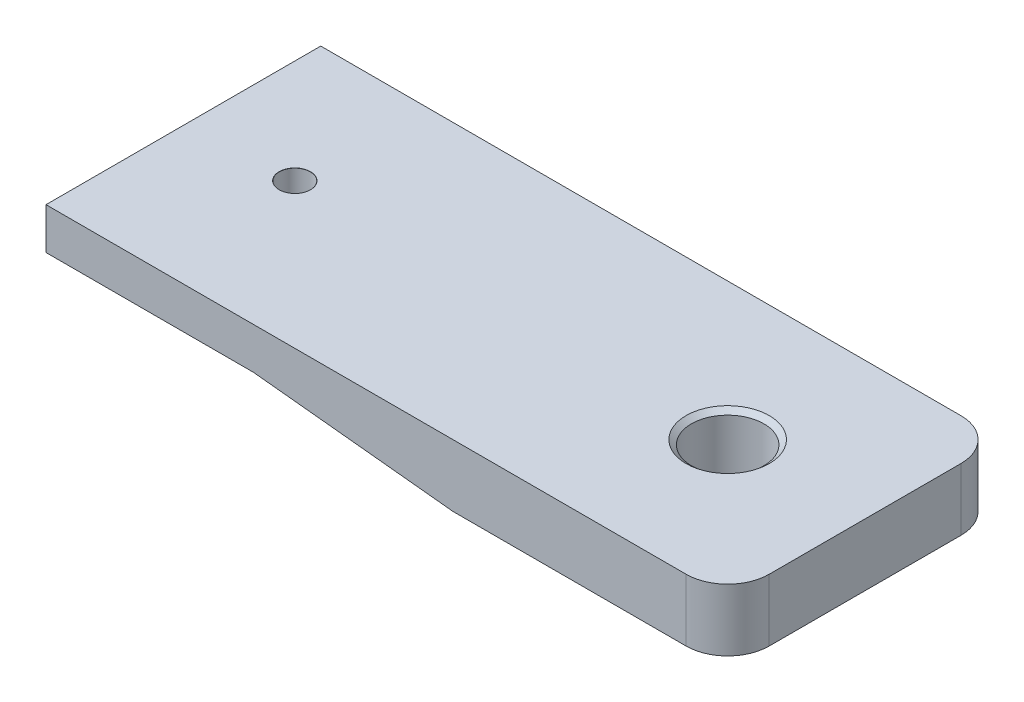
ISO-10303-21;
HEADER;
FILE_DESCRIPTION(('STEP AP214'),'2;1');
FILE_NAME('part.step','',(''),(''),'','','');
FILE_SCHEMA(('AUTOMOTIVE_DESIGN { 1 0 10303 214 1 1 1 1 }'));
ENDSEC;
DATA;
#1=APPLICATION_CONTEXT('core data for automotive mechanical design processes');
#2=APPLICATION_PROTOCOL_DEFINITION('international standard','automotive_design',2000,#1);
#3=PRODUCT_CONTEXT('',#1,'mechanical');
#4=PRODUCT('Part','Part','',(#3));
#5=PRODUCT_RELATED_PRODUCT_CATEGORY('part','',(#4));
#6=PRODUCT_DEFINITION_FORMATION('','',#4);
#7=PRODUCT_DEFINITION_CONTEXT('part definition',#1,'design');
#8=PRODUCT_DEFINITION('design','',#6,#7);
#9=PRODUCT_DEFINITION_SHAPE('','',#8);
#10=(LENGTH_UNIT() NAMED_UNIT(*) SI_UNIT(.MILLI.,.METRE.));
#11=(NAMED_UNIT(*) PLANE_ANGLE_UNIT() SI_UNIT($,.RADIAN.));
#12=(NAMED_UNIT(*) SI_UNIT($,.STERADIAN.) SOLID_ANGLE_UNIT());
#13=UNCERTAINTY_MEASURE_WITH_UNIT(LENGTH_MEASURE(1.E-05),#10,'distance_accuracy_value','');
#14=(GEOMETRIC_REPRESENTATION_CONTEXT(3) GLOBAL_UNCERTAINTY_ASSIGNED_CONTEXT((#13)) GLOBAL_UNIT_ASSIGNED_CONTEXT((#10,
#11,#12)) REPRESENTATION_CONTEXT('',''));
#15=CARTESIAN_POINT('',(0.,0.,0.));
#16=DIRECTION('',(0.,0.,1.));
#17=DIRECTION('',(1.,0.,0.));
#18=AXIS2_PLACEMENT_3D('',#15,#16,#17);
#19=CARTESIAN_POINT('',(-38.5,3.99999999999998,53.));
#20=DIRECTION('',(0.103339855073382,0.994646105081306,0.));
#21=DIRECTION('',(-0.994646105081306,0.103339855073382,0.));
#22=AXIS2_PLACEMENT_3D('',#19,#20,#21);
#23=PLANE('',#22);
#24=DIRECTION('',(0.994646105081306,-0.103339855073382,0.));
#25=VECTOR('',#24,1.);
#26=CARTESIAN_POINT('',(-38.5,3.99999999999998,0.));
#27=LINE('',#26,#25);
#28=CARTESIAN_POINT('',(-38.5,3.99999999999998,0.));
#29=VERTEX_POINT('',#28);
#30=CARTESIAN_POINT('',(0.,0.,0.));
#31=VERTEX_POINT('',#30);
#32=EDGE_CURVE('E122',#29,#31,#27,.T.);
#33=ORIENTED_EDGE('',*,*,#32,.T.);
#34=DIRECTION('',(0.,0.,-1.));
#35=VECTOR('',#34,1.);
#36=CARTESIAN_POINT('',(0.,0.,53.));
#37=LINE('',#36,#35);
#38=CARTESIAN_POINT('',(0.,0.,53.));
#39=VERTEX_POINT('',#38);
#40=EDGE_CURVE('E103',#39,#31,#37,.T.);
#41=ORIENTED_EDGE('',*,*,#40,.F.);
#42=DIRECTION('',(0.994646105081306,-0.103339855073382,0.));
#43=VECTOR('',#42,1.);
#44=CARTESIAN_POINT('',(-38.5,3.99999999999998,53.));
#45=LINE('',#44,#43);
#46=CARTESIAN_POINT('',(-38.5,3.99999999999998,53.));
#47=VERTEX_POINT('',#46);
#48=EDGE_CURVE('E110',#47,#39,#45,.T.);
#49=ORIENTED_EDGE('',*,*,#48,.F.);
#50=DIRECTION('',(0.,0.,-1.));
#51=VECTOR('',#50,1.);
#52=CARTESIAN_POINT('',(-38.5,3.99999999999998,53.));
#53=LINE('',#52,#51);
#54=EDGE_CURVE('E157',#47,#29,#53,.T.);
#55=ORIENTED_EDGE('',*,*,#54,.T.);
#56=EDGE_LOOP('',(#33,#41,#49,#55));
#57=FACE_BOUND('',#56,.T.);
#58=ADVANCED_FACE('F35',(#57),#23,.F.);
#59=CARTESIAN_POINT('',(0.,0.,53.));
#60=DIRECTION('',(0.,1.,0.));
#61=DIRECTION('',(0.,0.,1.));
#62=AXIS2_PLACEMENT_3D('',#59,#60,#61);
#63=PLANE('',#62);
#64=CARTESIAN_POINT('',(26.5,0.,26.5));
#65=DIRECTION('',(0.,1.,0.));
#66=DIRECTION('',(0.,0.,1.));
#67=AXIS2_PLACEMENT_3D('',#64,#65,#66);
#68=CIRCLE('',#67,7.);
#69=CARTESIAN_POINT('',(26.5,0.,33.5));
#70=VERTEX_POINT('',#69);
#71=EDGE_CURVE('E160',#70,#70,#68,.T.);
#72=ORIENTED_EDGE('',*,*,#71,.T.);
#73=EDGE_LOOP('',(#72));
#74=FACE_BOUND('',#73,.T.);
#75=DIRECTION('',(0.,0.,-1.));
#76=VECTOR('',#75,1.);
#77=CARTESIAN_POINT('',(53.,0.,53.));
#78=LINE('',#77,#76);
#79=CARTESIAN_POINT('',(53.,0.,45.));
#80=VERTEX_POINT('',#79);
#81=CARTESIAN_POINT('',(53.,0.,8.));
#82=VERTEX_POINT('',#81);
#83=EDGE_CURVE('E124',#80,#82,#78,.T.);
#84=ORIENTED_EDGE('',*,*,#83,.F.);
#85=CARTESIAN_POINT('',(45.,0.,45.));
#86=DIRECTION('',(0.,1.,0.));
#87=DIRECTION('',(0.,0.,1.));
#88=AXIS2_PLACEMENT_3D('',#85,#86,#87);
#89=CIRCLE('',#88,8.);
#90=CARTESIAN_POINT('',(45.,0.,53.));
#91=VERTEX_POINT('',#90);
#92=EDGE_CURVE('E11',#80,#91,#89,.F.);
#93=ORIENTED_EDGE('',*,*,#92,.T.);
#94=DIRECTION('',(1.,0.,0.));
#95=VECTOR('',#94,1.);
#96=CARTESIAN_POINT('',(0.,0.,53.));
#97=LINE('',#96,#95);
#98=EDGE_CURVE('E98',#39,#91,#97,.T.);
#99=ORIENTED_EDGE('',*,*,#98,.F.);
#100=ORIENTED_EDGE('',*,*,#40,.T.);
#101=DIRECTION('',(1.,0.,0.));
#102=VECTOR('',#101,1.);
#103=CARTESIAN_POINT('',(0.,0.,0.));
#104=LINE('',#103,#102);
#105=CARTESIAN_POINT('',(45.,0.,0.));
#106=VERTEX_POINT('',#105);
#107=EDGE_CURVE('E159',#31,#106,#104,.T.);
#108=ORIENTED_EDGE('',*,*,#107,.T.);
#109=CARTESIAN_POINT('',(45.,0.,8.));
#110=DIRECTION('',(0.,1.,0.));
#111=DIRECTION('',(0.,0.,1.));
#112=AXIS2_PLACEMENT_3D('',#109,#110,#111);
#113=CIRCLE('',#112,8.);
#114=EDGE_CURVE('E136',#106,#82,#113,.F.);
#115=ORIENTED_EDGE('',*,*,#114,.T.);
#116=EDGE_LOOP('',(#84,#93,#99,#100,#108,#115));
#117=FACE_BOUND('',#116,.T.);
#118=ADVANCED_FACE('F100',(#74,#117),#63,.F.);
#119=CARTESIAN_POINT('',(53.,0.,53.));
#120=DIRECTION('',(-1.,0.,0.));
#121=DIRECTION('',(0.,0.,1.));
#122=AXIS2_PLACEMENT_3D('',#119,#120,#121);
#123=PLANE('',#122);
#124=DIRECTION('',(0.,0.,-1.));
#125=VECTOR('',#124,1.);
#126=CARTESIAN_POINT('',(53.,12.,53.));
#127=LINE('',#126,#125);
#128=CARTESIAN_POINT('',(53.,12.,45.));
#129=VERTEX_POINT('',#128);
#130=CARTESIAN_POINT('',(53.,12.,8.));
#131=VERTEX_POINT('',#130);
#132=EDGE_CURVE('E129',#129,#131,#127,.T.);
#133=ORIENTED_EDGE('',*,*,#132,.F.);
#134=DIRECTION('',(0.,1.,0.));
#135=VECTOR('',#134,1.);
#136=CARTESIAN_POINT('',(53.,0.,45.));
#137=LINE('',#136,#135);
#138=EDGE_CURVE('E43',#129,#80,#137,.F.);
#139=ORIENTED_EDGE('',*,*,#138,.T.);
#140=ORIENTED_EDGE('',*,*,#83,.T.);
#141=DIRECTION('',(0.,1.,0.));
#142=VECTOR('',#141,1.);
#143=CARTESIAN_POINT('',(53.,0.,8.));
#144=LINE('',#143,#142);
#145=EDGE_CURVE('E123',#82,#131,#144,.T.);
#146=ORIENTED_EDGE('',*,*,#145,.T.);
#147=EDGE_LOOP('',(#133,#139,#140,#146));
#148=FACE_BOUND('',#147,.T.);
#149=ADVANCED_FACE('F178',(#148),#123,.F.);
#150=CARTESIAN_POINT('',(53.,12.,53.));
#151=DIRECTION('',(0.,-1.,0.));
#152=DIRECTION('',(1.,0.,0.));
#153=AXIS2_PLACEMENT_3D('',#150,#151,#152);
#154=PLANE('',#153);
#155=CARTESIAN_POINT('',(-58.5,12.,25.));
#156=DIRECTION('',(0.,1.,0.));
#157=DIRECTION('',(0.,0.,1.));
#158=AXIS2_PLACEMENT_3D('',#155,#156,#157);
#159=CIRCLE('',#158,3.025);
#160=CARTESIAN_POINT('',(-58.5,12.,28.025));
#161=VERTEX_POINT('',#160);
#162=EDGE_CURVE('E236',#161,#161,#159,.T.);
#163=ORIENTED_EDGE('',*,*,#162,.F.);
#164=EDGE_LOOP('',(#163));
#165=FACE_BOUND('',#164,.T.);
#166=CARTESIAN_POINT('',(26.5,12.,26.5));
#167=DIRECTION('',(0.,1.,0.));
#168=DIRECTION('',(0.,0.,1.));
#169=AXIS2_PLACEMENT_3D('',#166,#167,#168);
#170=CIRCLE('',#169,8.025);
#171=CARTESIAN_POINT('',(26.5,12.,34.525));
#172=VERTEX_POINT('',#171);
#173=EDGE_CURVE('E143',#172,#172,#170,.T.);
#174=ORIENTED_EDGE('',*,*,#173,.F.);
#175=EDGE_LOOP('',(#174));
#176=FACE_BOUND('',#175,.T.);
#177=DIRECTION('',(-1.,0.,0.));
#178=VECTOR('',#177,1.);
#179=CARTESIAN_POINT('',(53.,12.,53.));
#180=LINE('',#179,#178);
#181=CARTESIAN_POINT('',(45.,12.,53.));
#182=VERTEX_POINT('',#181);
#183=CARTESIAN_POINT('',(-78.5,12.,53.));
#184=VERTEX_POINT('',#183);
#185=EDGE_CURVE('E109',#182,#184,#180,.T.);
#186=ORIENTED_EDGE('',*,*,#185,.F.);
#187=CARTESIAN_POINT('',(45.,12.,45.));
#188=DIRECTION('',(0.,-1.,0.));
#189=DIRECTION('',(1.,0.,0.));
#190=AXIS2_PLACEMENT_3D('',#187,#188,#189);
#191=CIRCLE('',#190,8.);
#192=EDGE_CURVE('E57',#182,#129,#191,.F.);
#193=ORIENTED_EDGE('',*,*,#192,.T.);
#194=ORIENTED_EDGE('',*,*,#132,.T.);
#195=CARTESIAN_POINT('',(45.,12.,8.));
#196=DIRECTION('',(0.,-1.,0.));
#197=DIRECTION('',(1.,0.,0.));
#198=AXIS2_PLACEMENT_3D('',#195,#196,#197);
#199=CIRCLE('',#198,8.);
#200=CARTESIAN_POINT('',(45.,12.,0.));
#201=VERTEX_POINT('',#200);
#202=EDGE_CURVE('E127',#131,#201,#199,.F.);
#203=ORIENTED_EDGE('',*,*,#202,.T.);
#204=DIRECTION('',(-1.,0.,0.));
#205=VECTOR('',#204,1.);
#206=CARTESIAN_POINT('',(53.,12.,0.));
#207=LINE('',#206,#205);
#208=CARTESIAN_POINT('',(-78.5,12.,0.));
#209=VERTEX_POINT('',#208);
#210=EDGE_CURVE('E162',#201,#209,#207,.T.);
#211=ORIENTED_EDGE('',*,*,#210,.T.);
#212=DIRECTION('',(0.,0.,-1.));
#213=VECTOR('',#212,1.);
#214=CARTESIAN_POINT('',(-78.5,12.,53.));
#215=LINE('',#214,#213);
#216=EDGE_CURVE('E150',#184,#209,#215,.T.);
#217=ORIENTED_EDGE('',*,*,#216,.F.);
#218=EDGE_LOOP('',(#186,#193,#194,#203,#211,#217));
#219=FACE_BOUND('',#218,.T.);
#220=ADVANCED_FACE('F148',(#165,#176,#219),#154,.F.);
#221=CARTESIAN_POINT('',(-78.5,12.,53.));
#222=DIRECTION('',(1.,0.,0.));
#223=DIRECTION('',(0.,0.,-1.));
#224=AXIS2_PLACEMENT_3D('',#221,#222,#223);
#225=PLANE('',#224);
#226=DIRECTION('',(0.,-1.,0.));
#227=VECTOR('',#226,1.);
#228=CARTESIAN_POINT('',(-78.5,12.,0.));
#229=LINE('',#228,#227);
#230=CARTESIAN_POINT('',(-78.5,3.99999999999998,0.));
#231=VERTEX_POINT('',#230);
#232=EDGE_CURVE('E164',#209,#231,#229,.T.);
#233=ORIENTED_EDGE('',*,*,#232,.T.);
#234=DIRECTION('',(0.,0.,-1.));
#235=VECTOR('',#234,1.);
#236=CARTESIAN_POINT('',(-78.5,3.99999999999998,53.));
#237=LINE('',#236,#235);
#238=CARTESIAN_POINT('',(-78.5,3.99999999999998,53.));
#239=VERTEX_POINT('',#238);
#240=EDGE_CURVE('E168',#239,#231,#237,.T.);
#241=ORIENTED_EDGE('',*,*,#240,.F.);
#242=DIRECTION('',(0.,-1.,0.));
#243=VECTOR('',#242,1.);
#244=CARTESIAN_POINT('',(-78.5,12.,53.));
#245=LINE('',#244,#243);
#246=EDGE_CURVE('E152',#184,#239,#245,.T.);
#247=ORIENTED_EDGE('',*,*,#246,.F.);
#248=ORIENTED_EDGE('',*,*,#216,.T.);
#249=EDGE_LOOP('',(#233,#241,#247,#248));
#250=FACE_BOUND('',#249,.T.);
#251=ADVANCED_FACE('F184',(#250),#225,.F.);
#252=CARTESIAN_POINT('',(-78.5,3.99999999999998,53.));
#253=DIRECTION('',(0.,1.,0.));
#254=DIRECTION('',(0.,0.,1.));
#255=AXIS2_PLACEMENT_3D('',#252,#253,#254);
#256=PLANE('',#255);
#257=CARTESIAN_POINT('',(-58.5,3.99999999999998,25.));
#258=DIRECTION('',(0.,1.,0.));
#259=DIRECTION('',(0.,0.,1.));
#260=AXIS2_PLACEMENT_3D('',#257,#258,#259);
#261=CIRCLE('',#260,3.);
#262=CARTESIAN_POINT('',(-58.5,3.99999999999998,28.));
#263=VERTEX_POINT('',#262);
#264=EDGE_CURVE('E140',#263,#263,#261,.T.);
#265=ORIENTED_EDGE('',*,*,#264,.T.);
#266=EDGE_LOOP('',(#265));
#267=FACE_BOUND('',#266,.T.);
#268=DIRECTION('',(1.,0.,0.));
#269=VECTOR('',#268,1.);
#270=CARTESIAN_POINT('',(-78.5,3.99999999999998,0.));
#271=LINE('',#270,#269);
#272=EDGE_CURVE('E119',#231,#29,#271,.T.);
#273=ORIENTED_EDGE('',*,*,#272,.T.);
#274=ORIENTED_EDGE('',*,*,#54,.F.);
#275=DIRECTION('',(1.,0.,0.));
#276=VECTOR('',#275,1.);
#277=CARTESIAN_POINT('',(-78.5,3.99999999999998,53.));
#278=LINE('',#277,#276);
#279=EDGE_CURVE('E115',#239,#47,#278,.T.);
#280=ORIENTED_EDGE('',*,*,#279,.F.);
#281=ORIENTED_EDGE('',*,*,#240,.T.);
#282=EDGE_LOOP('',(#273,#274,#280,#281));
#283=FACE_BOUND('',#282,.T.);
#284=ADVANCED_FACE('F187',(#267,#283),#256,.F.);
#285=CARTESIAN_POINT('',(0.,0.,53.));
#286=DIRECTION('',(0.,0.,1.));
#287=DIRECTION('',(1.,0.,0.));
#288=AXIS2_PLACEMENT_3D('',#285,#286,#287);
#289=PLANE('',#288);
#290=ORIENTED_EDGE('',*,*,#98,.T.);
#291=DIRECTION('',(0.,1.,0.));
#292=VECTOR('',#291,1.);
#293=CARTESIAN_POINT('',(45.,12.,53.));
#294=LINE('',#293,#292);
#295=EDGE_CURVE('E139',#91,#182,#294,.T.);
#296=ORIENTED_EDGE('',*,*,#295,.T.);
#297=ORIENTED_EDGE('',*,*,#185,.T.);
#298=ORIENTED_EDGE('',*,*,#246,.T.);
#299=ORIENTED_EDGE('',*,*,#279,.T.);
#300=ORIENTED_EDGE('',*,*,#48,.T.);
#301=EDGE_LOOP('',(#290,#296,#297,#298,#299,#300));
#302=FACE_BOUND('',#301,.T.);
#303=ADVANCED_FACE('F113',(#302),#289,.T.);
#304=CARTESIAN_POINT('',(0.,0.,0.));
#305=DIRECTION('',(0.,0.,1.));
#306=DIRECTION('',(1.,0.,0.));
#307=AXIS2_PLACEMENT_3D('',#304,#305,#306);
#308=PLANE('',#307);
#309=ORIENTED_EDGE('',*,*,#210,.F.);
#310=DIRECTION('',(0.,1.,0.));
#311=VECTOR('',#310,1.);
#312=CARTESIAN_POINT('',(45.,0.,0.));
#313=LINE('',#312,#311);
#314=EDGE_CURVE('E134',#201,#106,#313,.F.);
#315=ORIENTED_EDGE('',*,*,#314,.T.);
#316=ORIENTED_EDGE('',*,*,#107,.F.);
#317=ORIENTED_EDGE('',*,*,#32,.F.);
#318=ORIENTED_EDGE('',*,*,#272,.F.);
#319=ORIENTED_EDGE('',*,*,#232,.F.);
#320=EDGE_LOOP('',(#309,#315,#316,#317,#318,#319));
#321=FACE_BOUND('',#320,.T.);
#322=ADVANCED_FACE('F180',(#321),#308,.F.);
#323=CARTESIAN_POINT('',(45.,0.,8.));
#324=DIRECTION('',(0.,1.,0.));
#325=DIRECTION('',(0.,0.,1.));
#326=AXIS2_PLACEMENT_3D('',#323,#324,#325);
#327=CYLINDRICAL_SURFACE('',#326,8.);
#328=ORIENTED_EDGE('',*,*,#114,.F.);
#329=ORIENTED_EDGE('',*,*,#314,.F.);
#330=ORIENTED_EDGE('',*,*,#202,.F.);
#331=ORIENTED_EDGE('',*,*,#145,.F.);
#332=EDGE_LOOP('',(#328,#329,#330,#331));
#333=FACE_BOUND('',#332,.T.);
#334=ADVANCED_FACE('F177',(#333),#327,.T.);
#335=CARTESIAN_POINT('',(26.5,12.,26.5));
#336=DIRECTION('',(0.,1.,0.));
#337=DIRECTION('',(0.,0.,1.));
#338=AXIS2_PLACEMENT_3D('',#335,#336,#337);
#339=CYLINDRICAL_SURFACE('',#338,7.);
#340=ORIENTED_EDGE('',*,*,#71,.F.);
#341=EDGE_LOOP('',(#340));
#342=FACE_BOUND('',#341,.T.);
#343=CARTESIAN_POINT('',(26.5,11.1399228780433,26.5));
#344=DIRECTION('',(0.,1.,0.));
#345=DIRECTION('',(0.,0.,1.));
#346=AXIS2_PLACEMENT_3D('',#343,#344,#345);
#347=CIRCLE('',#346,7.);
#348=CARTESIAN_POINT('',(26.5,11.1399228780433,33.5));
#349=VERTEX_POINT('',#348);
#350=EDGE_CURVE('E243',#349,#349,#347,.T.);
#351=ORIENTED_EDGE('',*,*,#350,.T.);
#352=EDGE_LOOP('',(#351));
#353=FACE_BOUND('',#352,.T.);
#354=ADVANCED_FACE('F207',(#342,#353),#339,.F.);
#355=CARTESIAN_POINT('',(26.5,12.,26.5));
#356=DIRECTION('',(0.,1.,0.));
#357=DIRECTION('',(0.,0.,1.));
#358=AXIS2_PLACEMENT_3D('',#355,#356,#357);
#359=CONICAL_SURFACE('',#358,8.025,0.872664625997165);
#360=ORIENTED_EDGE('',*,*,#350,.F.);
#361=EDGE_LOOP('',(#360));
#362=FACE_BOUND('',#361,.T.);
#363=ORIENTED_EDGE('',*,*,#173,.T.);
#364=EDGE_LOOP('',(#363));
#365=FACE_BOUND('',#364,.T.);
#366=ADVANCED_FACE('F212',(#362,#365),#359,.F.);
#367=CARTESIAN_POINT('',(-58.5,12.,25.));
#368=DIRECTION('',(0.,1.,0.));
#369=DIRECTION('',(0.,0.,1.));
#370=AXIS2_PLACEMENT_3D('',#367,#368,#369);
#371=CYLINDRICAL_SURFACE('',#370,3.);
#372=CARTESIAN_POINT('',(-58.5,11.9790225092206,25.));
#373=DIRECTION('',(0.,1.,0.));
#374=DIRECTION('',(0.,0.,1.));
#375=AXIS2_PLACEMENT_3D('',#372,#373,#374);
#376=CIRCLE('',#375,3.);
#377=CARTESIAN_POINT('',(-58.5,11.9790225092206,28.));
#378=VERTEX_POINT('',#377);
#379=EDGE_CURVE('E144',#378,#378,#376,.T.);
#380=ORIENTED_EDGE('',*,*,#379,.T.);
#381=EDGE_LOOP('',(#380));
#382=FACE_BOUND('',#381,.T.);
#383=ORIENTED_EDGE('',*,*,#264,.F.);
#384=EDGE_LOOP('',(#383));
#385=FACE_BOUND('',#384,.T.);
#386=ADVANCED_FACE('F220',(#382,#385),#371,.F.);
#387=CARTESIAN_POINT('',(-58.5,12.,25.));
#388=DIRECTION('',(0.,1.,0.));
#389=DIRECTION('',(0.,0.,1.));
#390=AXIS2_PLACEMENT_3D('',#387,#388,#389);
#391=CONICAL_SURFACE('',#390,3.025,0.872664625997227);
#392=ORIENTED_EDGE('',*,*,#379,.F.);
#393=EDGE_LOOP('',(#392));
#394=FACE_BOUND('',#393,.T.);
#395=ORIENTED_EDGE('',*,*,#162,.T.);
#396=EDGE_LOOP('',(#395));
#397=FACE_BOUND('',#396,.T.);
#398=ADVANCED_FACE('F224',(#394,#397),#391,.F.);
#399=CARTESIAN_POINT('',(45.,0.,45.));
#400=DIRECTION('',(0.,-1.,0.));
#401=DIRECTION('',(0.,0.,-1.));
#402=AXIS2_PLACEMENT_3D('',#399,#400,#401);
#403=CYLINDRICAL_SURFACE('',#402,8.);
#404=ORIENTED_EDGE('',*,*,#92,.F.);
#405=ORIENTED_EDGE('',*,*,#138,.F.);
#406=ORIENTED_EDGE('',*,*,#192,.F.);
#407=ORIENTED_EDGE('',*,*,#295,.F.);
#408=EDGE_LOOP('',(#404,#405,#406,#407));
#409=FACE_BOUND('',#408,.T.);
#410=ADVANCED_FACE('F37',(#409),#403,.T.);
#411=CLOSED_SHELL('',(#58,#118,#149,#220,#251,#284,#303,#322,#334,#354,#366,#386,#398,#410));
#412=MANIFOLD_SOLID_BREP('B2',#411);
#413=ADVANCED_BREP_SHAPE_REPRESENTATION('',(#18,#412),#14);
#414=SHAPE_DEFINITION_REPRESENTATION(#9,#413);
ENDSEC;
END-ISO-10303-21;
